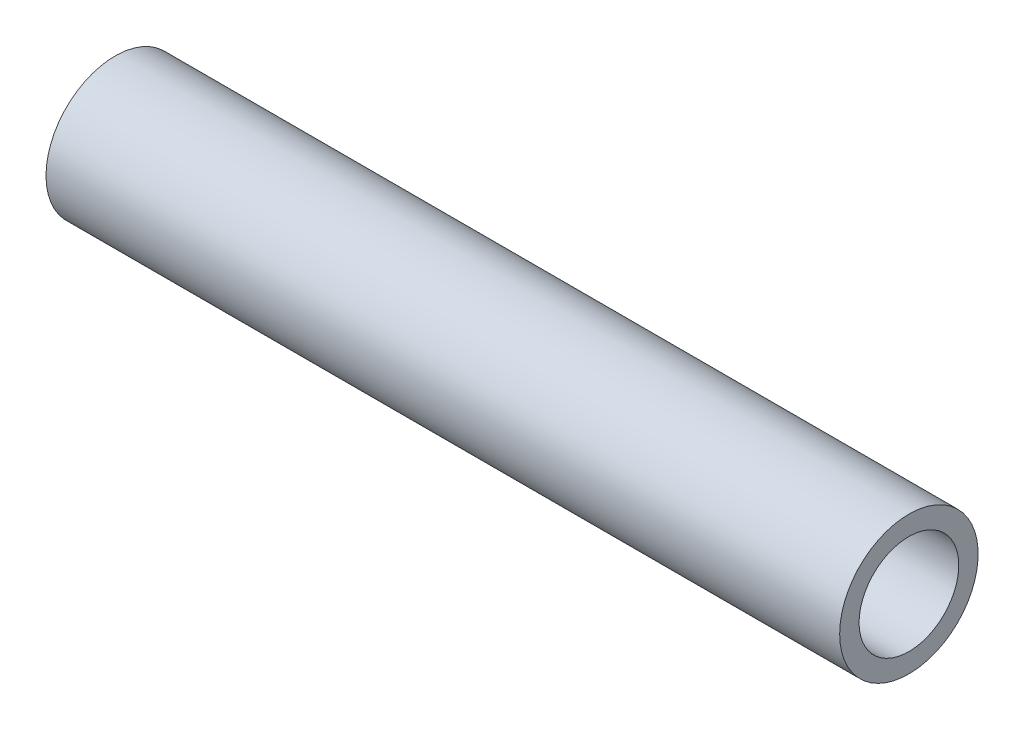
ISO-10303-21;
HEADER;
FILE_DESCRIPTION(('STEP AP214'),'2;1');
FILE_NAME('part.step','',(''),(''),'','','');
FILE_SCHEMA(('AUTOMOTIVE_DESIGN { 1 0 10303 214 1 1 1 1 }'));
ENDSEC;
DATA;
#1=APPLICATION_CONTEXT('core data for automotive mechanical design processes');
#2=APPLICATION_PROTOCOL_DEFINITION('international standard','automotive_design',2000,#1);
#3=PRODUCT_CONTEXT('',#1,'mechanical');
#4=PRODUCT('Part','Part','',(#3));
#5=PRODUCT_RELATED_PRODUCT_CATEGORY('part','',(#4));
#6=PRODUCT_DEFINITION_FORMATION('','',#4);
#7=PRODUCT_DEFINITION_CONTEXT('part definition',#1,'design');
#8=PRODUCT_DEFINITION('design','',#6,#7);
#9=PRODUCT_DEFINITION_SHAPE('','',#8);
#10=(LENGTH_UNIT() NAMED_UNIT(*) SI_UNIT(.MILLI.,.METRE.));
#11=(NAMED_UNIT(*) PLANE_ANGLE_UNIT() SI_UNIT($,.RADIAN.));
#12=(NAMED_UNIT(*) SI_UNIT($,.STERADIAN.) SOLID_ANGLE_UNIT());
#13=UNCERTAINTY_MEASURE_WITH_UNIT(LENGTH_MEASURE(1.E-05),#10,'distance_accuracy_value','');
#14=(GEOMETRIC_REPRESENTATION_CONTEXT(3) GLOBAL_UNCERTAINTY_ASSIGNED_CONTEXT((#13)) GLOBAL_UNIT_ASSIGNED_CONTEXT((#10,
#11,#12)) REPRESENTATION_CONTEXT('',''));
#15=CARTESIAN_POINT('',(0.,0.,0.));
#16=DIRECTION('',(0.,0.,1.));
#17=DIRECTION('',(1.,0.,0.));
#18=AXIS2_PLACEMENT_3D('',#15,#16,#17);
#19=CARTESIAN_POINT('',(-1000.,0.,0.));
#20=DIRECTION('',(-1.,0.,0.));
#21=DIRECTION('',(0.,0.,1.));
#22=AXIS2_PLACEMENT_3D('',#19,#20,#21);
#23=CYLINDRICAL_SURFACE('',#22,2.286);
#24=CARTESIAN_POINT('',(18.2,0.,0.));
#25=DIRECTION('',(-1.,0.,0.));
#26=DIRECTION('',(0.,0.,1.));
#27=AXIS2_PLACEMENT_3D('',#24,#25,#26);
#28=CIRCLE('',#27,2.286);
#29=CARTESIAN_POINT('',(18.2,0.,2.286));
#30=VERTEX_POINT('',#29);
#31=EDGE_CURVE('E52',#30,#30,#28,.T.);
#32=ORIENTED_EDGE('',*,*,#31,.F.);
#33=EDGE_LOOP('',(#32));
#34=FACE_BOUND('',#33,.T.);
#35=CARTESIAN_POINT('',(-18.2,0.,0.));
#36=DIRECTION('',(-1.,0.,0.));
#37=DIRECTION('',(0.,0.,1.));
#38=AXIS2_PLACEMENT_3D('',#35,#36,#37);
#39=CIRCLE('',#38,2.286);
#40=CARTESIAN_POINT('',(-18.2,0.,2.286));
#41=VERTEX_POINT('',#40);
#42=EDGE_CURVE('E10',#41,#41,#39,.T.);
#43=ORIENTED_EDGE('',*,*,#42,.T.);
#44=EDGE_LOOP('',(#43));
#45=FACE_BOUND('',#44,.T.);
#46=ADVANCED_FACE('F39',(#34,#45),#23,.F.);
#47=CARTESIAN_POINT('',(-18.2,2.286,0.));
#48=DIRECTION('',(1.,0.,0.));
#49=DIRECTION('',(0.,0.,-1.));
#50=AXIS2_PLACEMENT_3D('',#47,#48,#49);
#51=PLANE('',#50);
#52=ORIENTED_EDGE('',*,*,#42,.F.);
#53=EDGE_LOOP('',(#52));
#54=FACE_BOUND('',#53,.T.);
#55=CARTESIAN_POINT('',(-18.2,0.,0.));
#56=DIRECTION('',(-1.,0.,0.));
#57=DIRECTION('',(0.,0.,1.));
#58=AXIS2_PLACEMENT_3D('',#55,#56,#57);
#59=CIRCLE('',#58,3.175);
#60=CARTESIAN_POINT('',(-18.2,0.,3.175));
#61=VERTEX_POINT('',#60);
#62=EDGE_CURVE('E44',#61,#61,#59,.T.);
#63=ORIENTED_EDGE('',*,*,#62,.T.);
#64=EDGE_LOOP('',(#63));
#65=FACE_BOUND('',#64,.T.);
#66=ADVANCED_FACE('F65',(#54,#65),#51,.F.);
#67=CARTESIAN_POINT('',(-1000.,0.,0.));
#68=DIRECTION('',(-1.,0.,0.));
#69=DIRECTION('',(0.,0.,1.));
#70=AXIS2_PLACEMENT_3D('',#67,#68,#69);
#71=CYLINDRICAL_SURFACE('',#70,3.175);
#72=ORIENTED_EDGE('',*,*,#62,.F.);
#73=EDGE_LOOP('',(#72));
#74=FACE_BOUND('',#73,.T.);
#75=CARTESIAN_POINT('',(18.2,0.,0.));
#76=DIRECTION('',(-1.,0.,0.));
#77=DIRECTION('',(0.,0.,1.));
#78=AXIS2_PLACEMENT_3D('',#75,#76,#77);
#79=CIRCLE('',#78,3.175);
#80=CARTESIAN_POINT('',(18.2,0.,3.175));
#81=VERTEX_POINT('',#80);
#82=EDGE_CURVE('E47',#81,#81,#79,.T.);
#83=ORIENTED_EDGE('',*,*,#82,.T.);
#84=EDGE_LOOP('',(#83));
#85=FACE_BOUND('',#84,.T.);
#86=ADVANCED_FACE('F66',(#74,#85),#71,.T.);
#87=CARTESIAN_POINT('',(18.2,3.175,0.));
#88=DIRECTION('',(-1.,0.,0.));
#89=DIRECTION('',(0.,0.,1.));
#90=AXIS2_PLACEMENT_3D('',#87,#88,#89);
#91=PLANE('',#90);
#92=ORIENTED_EDGE('',*,*,#82,.F.);
#93=EDGE_LOOP('',(#92));
#94=FACE_BOUND('',#93,.T.);
#95=ORIENTED_EDGE('',*,*,#31,.T.);
#96=EDGE_LOOP('',(#95));
#97=FACE_BOUND('',#96,.T.);
#98=ADVANCED_FACE('F56',(#94,#97),#91,.F.);
#99=CLOSED_SHELL('',(#46,#66,#86,#98));
#100=MANIFOLD_SOLID_BREP('B2',#99);
#101=ADVANCED_BREP_SHAPE_REPRESENTATION('',(#18,#100),#14);
#102=SHAPE_DEFINITION_REPRESENTATION(#9,#101);
ENDSEC;
END-ISO-10303-21;
